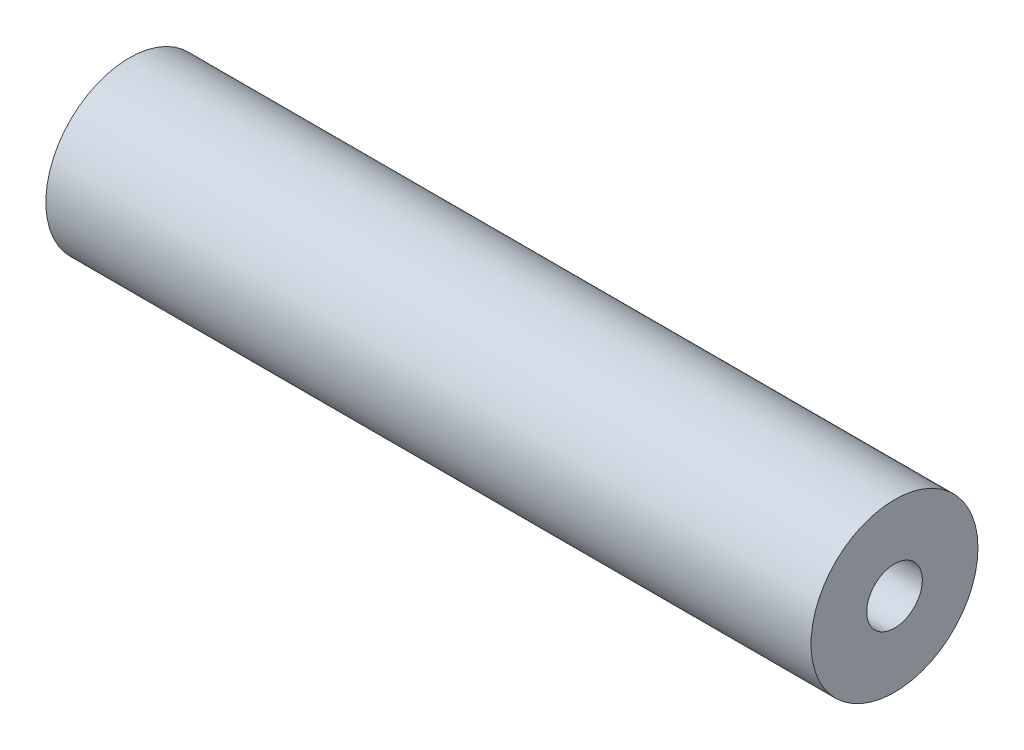
ISO-10303-21;
HEADER;
FILE_DESCRIPTION(('STEP AP214'),'2;1');
FILE_NAME('part.step','',(''),(''),'','','');
FILE_SCHEMA(('AUTOMOTIVE_DESIGN { 1 0 10303 214 1 1 1 1 }'));
ENDSEC;
DATA;
#1=APPLICATION_CONTEXT('core data for automotive mechanical design processes');
#2=APPLICATION_PROTOCOL_DEFINITION('international standard','automotive_design',2000,#1);
#3=PRODUCT_CONTEXT('',#1,'mechanical');
#4=PRODUCT('Part','Part','',(#3));
#5=PRODUCT_RELATED_PRODUCT_CATEGORY('part','',(#4));
#6=PRODUCT_DEFINITION_FORMATION('','',#4);
#7=PRODUCT_DEFINITION_CONTEXT('part definition',#1,'design');
#8=PRODUCT_DEFINITION('design','',#6,#7);
#9=PRODUCT_DEFINITION_SHAPE('','',#8);
#10=(LENGTH_UNIT() NAMED_UNIT(*) SI_UNIT(.MILLI.,.METRE.));
#11=(NAMED_UNIT(*) PLANE_ANGLE_UNIT() SI_UNIT($,.RADIAN.));
#12=(NAMED_UNIT(*) SI_UNIT($,.STERADIAN.) SOLID_ANGLE_UNIT());
#13=UNCERTAINTY_MEASURE_WITH_UNIT(LENGTH_MEASURE(1.E-05),#10,'distance_accuracy_value','');
#14=(GEOMETRIC_REPRESENTATION_CONTEXT(3) GLOBAL_UNCERTAINTY_ASSIGNED_CONTEXT((#13)) GLOBAL_UNIT_ASSIGNED_CONTEXT((#10,
#11,#12)) REPRESENTATION_CONTEXT('',''));
#15=CARTESIAN_POINT('',(0.,0.,0.));
#16=DIRECTION('',(0.,0.,1.));
#17=DIRECTION('',(1.,0.,0.));
#18=AXIS2_PLACEMENT_3D('',#15,#16,#17);
#19=CARTESIAN_POINT('',(110.,0.,0.));
#20=DIRECTION('',(-1.,0.,0.));
#21=DIRECTION('',(0.,0.,1.));
#22=AXIS2_PLACEMENT_3D('',#19,#20,#21);
#23=CYLINDRICAL_SURFACE('',#22,12.);
#24=CARTESIAN_POINT('',(110.,0.,0.));
#25=DIRECTION('',(1.,0.,0.));
#26=DIRECTION('',(0.,0.,-1.));
#27=AXIS2_PLACEMENT_3D('',#24,#25,#26);
#28=CIRCLE('',#27,12.);
#29=CARTESIAN_POINT('',(110.,0.,-12.));
#30=VERTEX_POINT('',#29);
#31=EDGE_CURVE('E10',#30,#30,#28,.T.);
#32=ORIENTED_EDGE('',*,*,#31,.F.);
#33=EDGE_LOOP('',(#32));
#34=FACE_BOUND('',#33,.T.);
#35=CARTESIAN_POINT('',(0.,0.,0.));
#36=DIRECTION('',(1.,0.,0.));
#37=DIRECTION('',(0.,0.,-1.));
#38=AXIS2_PLACEMENT_3D('',#35,#36,#37);
#39=CIRCLE('',#38,12.);
#40=CARTESIAN_POINT('',(0.,0.,-12.));
#41=VERTEX_POINT('',#40);
#42=EDGE_CURVE('E38',#41,#41,#39,.T.);
#43=ORIENTED_EDGE('',*,*,#42,.T.);
#44=EDGE_LOOP('',(#43));
#45=FACE_BOUND('',#44,.T.);
#46=ADVANCED_FACE('F31',(#34,#45),#23,.T.);
#47=CARTESIAN_POINT('',(110.,0.,0.));
#48=DIRECTION('',(1.,0.,0.));
#49=DIRECTION('',(0.,0.,-1.));
#50=AXIS2_PLACEMENT_3D('',#47,#48,#49);
#51=PLANE('',#50);
#52=CARTESIAN_POINT('',(110.,0.,0.));
#53=DIRECTION('',(1.,0.,0.));
#54=DIRECTION('',(0.,0.,-1.));
#55=AXIS2_PLACEMENT_3D('',#52,#53,#54);
#56=CIRCLE('',#55,4.);
#57=CARTESIAN_POINT('',(110.,0.,-4.));
#58=VERTEX_POINT('',#57);
#59=EDGE_CURVE('E44',#58,#58,#56,.T.);
#60=ORIENTED_EDGE('',*,*,#59,.F.);
#61=EDGE_LOOP('',(#60));
#62=FACE_BOUND('',#61,.T.);
#63=ORIENTED_EDGE('',*,*,#31,.T.);
#64=EDGE_LOOP('',(#63));
#65=FACE_BOUND('',#64,.T.);
#66=ADVANCED_FACE('F60',(#62,#65),#51,.T.);
#67=CARTESIAN_POINT('',(0.,0.,0.));
#68=DIRECTION('',(1.,0.,0.));
#69=DIRECTION('',(0.,0.,-1.));
#70=AXIS2_PLACEMENT_3D('',#67,#68,#69);
#71=PLANE('',#70);
#72=CARTESIAN_POINT('',(0.,0.,0.));
#73=DIRECTION('',(1.,0.,0.));
#74=DIRECTION('',(0.,0.,-1.));
#75=AXIS2_PLACEMENT_3D('',#72,#73,#74);
#76=CIRCLE('',#75,4.);
#77=CARTESIAN_POINT('',(0.,0.,-4.));
#78=VERTEX_POINT('',#77);
#79=EDGE_CURVE('E34',#78,#78,#76,.T.);
#80=ORIENTED_EDGE('',*,*,#79,.T.);
#81=EDGE_LOOP('',(#80));
#82=FACE_BOUND('',#81,.T.);
#83=ORIENTED_EDGE('',*,*,#42,.F.);
#84=EDGE_LOOP('',(#83));
#85=FACE_BOUND('',#84,.T.);
#86=ADVANCED_FACE('F51',(#82,#85),#71,.F.);
#87=CARTESIAN_POINT('',(-112.,0.,0.));
#88=DIRECTION('',(1.,0.,0.));
#89=DIRECTION('',(0.,0.,-1.));
#90=AXIS2_PLACEMENT_3D('',#87,#88,#89);
#91=CYLINDRICAL_SURFACE('',#90,4.);
#92=ORIENTED_EDGE('',*,*,#59,.T.);
#93=EDGE_LOOP('',(#92));
#94=FACE_BOUND('',#93,.T.);
#95=ORIENTED_EDGE('',*,*,#79,.F.);
#96=EDGE_LOOP('',(#95));
#97=FACE_BOUND('',#96,.T.);
#98=ADVANCED_FACE('F54',(#94,#97),#91,.F.);
#99=CLOSED_SHELL('',(#46,#66,#86,#98));
#100=MANIFOLD_SOLID_BREP('B2',#99);
#101=ADVANCED_BREP_SHAPE_REPRESENTATION('',(#18,#100),#14);
#102=SHAPE_DEFINITION_REPRESENTATION(#9,#101);
ENDSEC;
END-ISO-10303-21;
